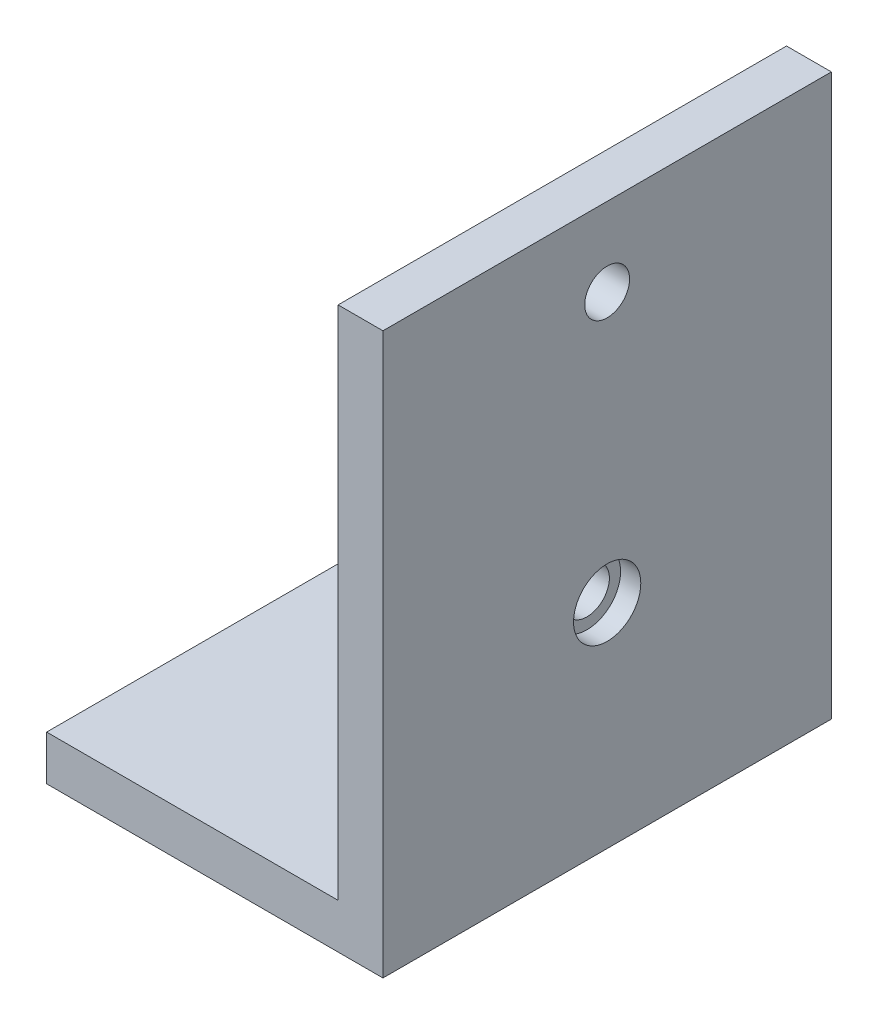
ISO-10303-21;
HEADER;
FILE_DESCRIPTION(('STEP AP214'),'2;1');
FILE_NAME('part.step','',(''),(''),'','','');
FILE_SCHEMA(('AUTOMOTIVE_DESIGN { 1 0 10303 214 1 1 1 1 }'));
ENDSEC;
DATA;
#1=APPLICATION_CONTEXT('core data for automotive mechanical design processes');
#2=APPLICATION_PROTOCOL_DEFINITION('international standard','automotive_design',2000,#1);
#3=PRODUCT_CONTEXT('',#1,'mechanical');
#4=PRODUCT('Part','Part','',(#3));
#5=PRODUCT_RELATED_PRODUCT_CATEGORY('part','',(#4));
#6=PRODUCT_DEFINITION_FORMATION('','',#4);
#7=PRODUCT_DEFINITION_CONTEXT('part definition',#1,'design');
#8=PRODUCT_DEFINITION('design','',#6,#7);
#9=PRODUCT_DEFINITION_SHAPE('','',#8);
#10=(LENGTH_UNIT() NAMED_UNIT(*) SI_UNIT(.MILLI.,.METRE.));
#11=(NAMED_UNIT(*) PLANE_ANGLE_UNIT() SI_UNIT($,.RADIAN.));
#12=(NAMED_UNIT(*) SI_UNIT($,.STERADIAN.) SOLID_ANGLE_UNIT());
#13=UNCERTAINTY_MEASURE_WITH_UNIT(LENGTH_MEASURE(1.E-05),#10,'distance_accuracy_value','');
#14=(GEOMETRIC_REPRESENTATION_CONTEXT(3) GLOBAL_UNCERTAINTY_ASSIGNED_CONTEXT((#13)) GLOBAL_UNIT_ASSIGNED_CONTEXT((#10,
#11,#12)) REPRESENTATION_CONTEXT('',''));
#15=CARTESIAN_POINT('',(0.,0.,0.));
#16=DIRECTION('',(0.,0.,1.));
#17=DIRECTION('',(1.,0.,0.));
#18=AXIS2_PLACEMENT_3D('',#15,#16,#17);
#19=CARTESIAN_POINT('',(-10.,47.5,50.));
#20=DIRECTION('',(1.,0.,0.));
#21=DIRECTION('',(0.,0.,-1.));
#22=AXIS2_PLACEMENT_3D('',#19,#20,#21);
#23=CYLINDRICAL_SURFACE('',#22,5.);
#24=CARTESIAN_POINT('',(-10.,47.5,50.));
#25=DIRECTION('',(1.,0.,0.));
#26=DIRECTION('',(0.,0.,-1.));
#27=AXIS2_PLACEMENT_3D('',#24,#25,#26);
#28=CIRCLE('',#27,5.);
#29=CARTESIAN_POINT('',(-10.,47.5,45.));
#30=VERTEX_POINT('',#29);
#31=EDGE_CURVE('E216',#30,#30,#28,.T.);
#32=ORIENTED_EDGE('',*,*,#31,.F.);
#33=EDGE_LOOP('',(#32));
#34=FACE_BOUND('',#33,.T.);
#35=CARTESIAN_POINT('',(-4.5,47.5,50.));
#36=DIRECTION('',(1.,0.,0.));
#37=DIRECTION('',(0.,0.,-1.));
#38=AXIS2_PLACEMENT_3D('',#35,#36,#37);
#39=CIRCLE('',#38,5.);
#40=CARTESIAN_POINT('',(-4.5,47.5,45.));
#41=VERTEX_POINT('',#40);
#42=EDGE_CURVE('E37',#41,#41,#39,.F.);
#43=ORIENTED_EDGE('',*,*,#42,.F.);
#44=EDGE_LOOP('',(#43));
#45=FACE_BOUND('',#44,.T.);
#46=ADVANCED_FACE('F33',(#34,#45),#23,.F.);
#47=CARTESIAN_POINT('',(0.,10.,100.));
#48=DIRECTION('',(0.,-1.,0.));
#49=DIRECTION('',(0.,0.,-1.));
#50=AXIS2_PLACEMENT_3D('',#47,#48,#49);
#51=PLANE('',#50);
#52=DIRECTION('',(1.,0.,0.));
#53=VECTOR('',#52,1.);
#54=CARTESIAN_POINT('',(0.,10.,0.));
#55=LINE('',#54,#53);
#56=CARTESIAN_POINT('',(-10.,10.,0.));
#57=VERTEX_POINT('',#56);
#58=CARTESIAN_POINT('',(-75.,10.,0.));
#59=VERTEX_POINT('',#58);
#60=EDGE_CURVE('E116',#57,#59,#55,.F.);
#61=ORIENTED_EDGE('',*,*,#60,.T.);
#62=DIRECTION('',(0.,0.,-1.));
#63=VECTOR('',#62,1.);
#64=CARTESIAN_POINT('',(-75.,10.,100.));
#65=LINE('',#64,#63);
#66=CARTESIAN_POINT('',(-75.,10.,100.));
#67=VERTEX_POINT('',#66);
#68=EDGE_CURVE('E11',#67,#59,#65,.T.);
#69=ORIENTED_EDGE('',*,*,#68,.F.);
#70=DIRECTION('',(1.,0.,0.));
#71=VECTOR('',#70,1.);
#72=CARTESIAN_POINT('',(0.,10.,100.));
#73=LINE('',#72,#71);
#74=CARTESIAN_POINT('',(-10.,10.,100.));
#75=VERTEX_POINT('',#74);
#76=EDGE_CURVE('E81',#75,#67,#73,.F.);
#77=ORIENTED_EDGE('',*,*,#76,.F.);
#78=DIRECTION('',(0.,0.,-1.));
#79=VECTOR('',#78,1.);
#80=CARTESIAN_POINT('',(-10.,10.,100.));
#81=LINE('',#80,#79);
#82=EDGE_CURVE('E112',#75,#57,#81,.T.);
#83=ORIENTED_EDGE('',*,*,#82,.T.);
#84=EDGE_LOOP('',(#61,#69,#77,#83));
#85=FACE_BOUND('',#84,.T.);
#86=ADVANCED_FACE('F35',(#85),#51,.F.);
#87=CARTESIAN_POINT('',(-75.,0.,100.));
#88=DIRECTION('',(-1.,0.,0.));
#89=DIRECTION('',(0.,0.,1.));
#90=AXIS2_PLACEMENT_3D('',#87,#88,#89);
#91=PLANE('',#90);
#92=DIRECTION('',(0.,1.,0.));
#93=VECTOR('',#92,1.);
#94=CARTESIAN_POINT('',(-75.,0.,0.));
#95=LINE('',#94,#93);
#96=CARTESIAN_POINT('',(-75.,0.,0.));
#97=VERTEX_POINT('',#96);
#98=EDGE_CURVE('E119',#97,#59,#95,.T.);
#99=ORIENTED_EDGE('',*,*,#98,.F.);
#100=DIRECTION('',(0.,0.,-1.));
#101=VECTOR('',#100,1.);
#102=CARTESIAN_POINT('',(-75.,0.,100.));
#103=LINE('',#102,#101);
#104=CARTESIAN_POINT('',(-75.,0.,100.));
#105=VERTEX_POINT('',#104);
#106=EDGE_CURVE('E43',#105,#97,#103,.T.);
#107=ORIENTED_EDGE('',*,*,#106,.F.);
#108=DIRECTION('',(0.,1.,0.));
#109=VECTOR('',#108,1.);
#110=CARTESIAN_POINT('',(-75.,0.,100.));
#111=LINE('',#110,#109);
#112=EDGE_CURVE('E224',#105,#67,#111,.T.);
#113=ORIENTED_EDGE('',*,*,#112,.T.);
#114=ORIENTED_EDGE('',*,*,#68,.T.);
#115=EDGE_LOOP('',(#99,#107,#113,#114));
#116=FACE_BOUND('',#115,.T.);
#117=ADVANCED_FACE('F139',(#116),#91,.T.);
#118=CARTESIAN_POINT('',(0.,0.,100.));
#119=DIRECTION('',(0.,-1.,0.));
#120=DIRECTION('',(0.,0.,-1.));
#121=AXIS2_PLACEMENT_3D('',#118,#119,#120);
#122=PLANE('',#121);
#123=DIRECTION('',(-1.,0.,0.));
#124=VECTOR('',#123,1.);
#125=CARTESIAN_POINT('',(0.,0.,0.));
#126=LINE('',#125,#124);
#127=CARTESIAN_POINT('',(0.,0.,0.));
#128=VERTEX_POINT('',#127);
#129=EDGE_CURVE('E123',#128,#97,#126,.T.);
#130=ORIENTED_EDGE('',*,*,#129,.F.);
#131=DIRECTION('',(0.,0.,-1.));
#132=VECTOR('',#131,1.);
#133=CARTESIAN_POINT('',(0.,0.,100.));
#134=LINE('',#133,#132);
#135=CARTESIAN_POINT('',(0.,0.,100.));
#136=VERTEX_POINT('',#135);
#137=EDGE_CURVE('E102',#136,#128,#134,.T.);
#138=ORIENTED_EDGE('',*,*,#137,.F.);
#139=DIRECTION('',(-1.,0.,0.));
#140=VECTOR('',#139,1.);
#141=CARTESIAN_POINT('',(0.,0.,100.));
#142=LINE('',#141,#140);
#143=EDGE_CURVE('E108',#136,#105,#142,.T.);
#144=ORIENTED_EDGE('',*,*,#143,.T.);
#145=ORIENTED_EDGE('',*,*,#106,.T.);
#146=EDGE_LOOP('',(#130,#138,#144,#145));
#147=FACE_BOUND('',#146,.T.);
#148=ADVANCED_FACE('F136',(#147),#122,.T.);
#149=CARTESIAN_POINT('',(0.,125.,100.));
#150=DIRECTION('',(1.,0.,0.));
#151=DIRECTION('',(0.,0.,-1.));
#152=AXIS2_PLACEMENT_3D('',#149,#150,#151);
#153=PLANE('',#152);
#154=CARTESIAN_POINT('',(0.,47.5,50.));
#155=DIRECTION('',(1.,0.,0.));
#156=DIRECTION('',(0.,0.,-1.));
#157=AXIS2_PLACEMENT_3D('',#154,#155,#156);
#158=CIRCLE('',#157,7.5);
#159=CARTESIAN_POINT('',(0.,47.5,42.5));
#160=VERTEX_POINT('',#159);
#161=EDGE_CURVE('E211',#160,#160,#158,.T.);
#162=ORIENTED_EDGE('',*,*,#161,.F.);
#163=EDGE_LOOP('',(#162));
#164=FACE_BOUND('',#163,.T.);
#165=CARTESIAN_POINT('',(0.,107.5,50.));
#166=DIRECTION('',(1.,0.,0.));
#167=DIRECTION('',(0.,0.,-1.));
#168=AXIS2_PLACEMENT_3D('',#165,#166,#167);
#169=CIRCLE('',#168,5.);
#170=CARTESIAN_POINT('',(0.,107.5,45.));
#171=VERTEX_POINT('',#170);
#172=EDGE_CURVE('E218',#171,#171,#169,.T.);
#173=ORIENTED_EDGE('',*,*,#172,.F.);
#174=EDGE_LOOP('',(#173));
#175=FACE_BOUND('',#174,.T.);
#176=DIRECTION('',(0.,-1.,0.));
#177=VECTOR('',#176,1.);
#178=CARTESIAN_POINT('',(0.,125.,0.));
#179=LINE('',#178,#177);
#180=CARTESIAN_POINT('',(0.,125.,0.));
#181=VERTEX_POINT('',#180);
#182=EDGE_CURVE('E97',#181,#128,#179,.T.);
#183=ORIENTED_EDGE('',*,*,#182,.F.);
#184=DIRECTION('',(0.,0.,-1.));
#185=VECTOR('',#184,1.);
#186=CARTESIAN_POINT('',(0.,125.,100.));
#187=LINE('',#186,#185);
#188=CARTESIAN_POINT('',(0.,125.,100.));
#189=VERTEX_POINT('',#188);
#190=EDGE_CURVE('E92',#189,#181,#187,.T.);
#191=ORIENTED_EDGE('',*,*,#190,.F.);
#192=DIRECTION('',(0.,-1.,0.));
#193=VECTOR('',#192,1.);
#194=CARTESIAN_POINT('',(0.,125.,100.));
#195=LINE('',#194,#193);
#196=EDGE_CURVE('E95',#189,#136,#195,.T.);
#197=ORIENTED_EDGE('',*,*,#196,.T.);
#198=ORIENTED_EDGE('',*,*,#137,.T.);
#199=EDGE_LOOP('',(#183,#191,#197,#198));
#200=FACE_BOUND('',#199,.T.);
#201=ADVANCED_FACE('F94',(#164,#175,#200),#153,.T.);
#202=CARTESIAN_POINT('',(-10.,125.,100.));
#203=DIRECTION('',(0.,1.,0.));
#204=DIRECTION('',(0.,0.,1.));
#205=AXIS2_PLACEMENT_3D('',#202,#203,#204);
#206=PLANE('',#205);
#207=DIRECTION('',(1.,0.,0.));
#208=VECTOR('',#207,1.);
#209=CARTESIAN_POINT('',(-10.,125.,0.));
#210=LINE('',#209,#208);
#211=CARTESIAN_POINT('',(-10.,125.,0.));
#212=VERTEX_POINT('',#211);
#213=EDGE_CURVE('E127',#212,#181,#210,.T.);
#214=ORIENTED_EDGE('',*,*,#213,.F.);
#215=DIRECTION('',(0.,0.,-1.));
#216=VECTOR('',#215,1.);
#217=CARTESIAN_POINT('',(-10.,125.,100.));
#218=LINE('',#217,#216);
#219=CARTESIAN_POINT('',(-10.,125.,100.));
#220=VERTEX_POINT('',#219);
#221=EDGE_CURVE('E72',#220,#212,#218,.T.);
#222=ORIENTED_EDGE('',*,*,#221,.F.);
#223=DIRECTION('',(1.,0.,0.));
#224=VECTOR('',#223,1.);
#225=CARTESIAN_POINT('',(-10.,125.,100.));
#226=LINE('',#225,#224);
#227=EDGE_CURVE('E106',#220,#189,#226,.T.);
#228=ORIENTED_EDGE('',*,*,#227,.T.);
#229=ORIENTED_EDGE('',*,*,#190,.T.);
#230=EDGE_LOOP('',(#214,#222,#228,#229));
#231=FACE_BOUND('',#230,.T.);
#232=ADVANCED_FACE('F110',(#231),#206,.T.);
#233=CARTESIAN_POINT('',(-10.,125.,100.));
#234=DIRECTION('',(1.,0.,0.));
#235=DIRECTION('',(0.,0.,-1.));
#236=AXIS2_PLACEMENT_3D('',#233,#234,#235);
#237=PLANE('',#236);
#238=ORIENTED_EDGE('',*,*,#31,.T.);
#239=EDGE_LOOP('',(#238));
#240=FACE_BOUND('',#239,.T.);
#241=CARTESIAN_POINT('',(-10.,107.5,50.));
#242=DIRECTION('',(1.,0.,0.));
#243=DIRECTION('',(0.,0.,-1.));
#244=AXIS2_PLACEMENT_3D('',#241,#242,#243);
#245=CIRCLE('',#244,5.);
#246=CARTESIAN_POINT('',(-10.,107.5,45.));
#247=VERTEX_POINT('',#246);
#248=EDGE_CURVE('E120',#247,#247,#245,.T.);
#249=ORIENTED_EDGE('',*,*,#248,.T.);
#250=EDGE_LOOP('',(#249));
#251=FACE_BOUND('',#250,.T.);
#252=DIRECTION('',(0.,1.,0.));
#253=VECTOR('',#252,1.);
#254=CARTESIAN_POINT('',(-10.,125.,0.));
#255=LINE('',#254,#253);
#256=EDGE_CURVE('E75',#212,#57,#255,.F.);
#257=ORIENTED_EDGE('',*,*,#256,.T.);
#258=ORIENTED_EDGE('',*,*,#82,.F.);
#259=DIRECTION('',(0.,1.,0.));
#260=VECTOR('',#259,1.);
#261=CARTESIAN_POINT('',(-10.,125.,100.));
#262=LINE('',#261,#260);
#263=EDGE_CURVE('E51',#220,#75,#262,.F.);
#264=ORIENTED_EDGE('',*,*,#263,.F.);
#265=ORIENTED_EDGE('',*,*,#221,.T.);
#266=EDGE_LOOP('',(#257,#258,#264,#265));
#267=FACE_BOUND('',#266,.T.);
#268=ADVANCED_FACE('F144',(#240,#251,#267),#237,.F.);
#269=CARTESIAN_POINT('',(0.,0.,100.));
#270=DIRECTION('',(0.,0.,1.));
#271=DIRECTION('',(1.,0.,0.));
#272=AXIS2_PLACEMENT_3D('',#269,#270,#271);
#273=PLANE('',#272);
#274=ORIENTED_EDGE('',*,*,#76,.T.);
#275=ORIENTED_EDGE('',*,*,#112,.F.);
#276=ORIENTED_EDGE('',*,*,#143,.F.);
#277=ORIENTED_EDGE('',*,*,#196,.F.);
#278=ORIENTED_EDGE('',*,*,#227,.F.);
#279=ORIENTED_EDGE('',*,*,#263,.T.);
#280=EDGE_LOOP('',(#274,#275,#276,#277,#278,#279));
#281=FACE_BOUND('',#280,.T.);
#282=ADVANCED_FACE('F105',(#281),#273,.T.);
#283=CARTESIAN_POINT('',(0.,0.,0.));
#284=DIRECTION('',(0.,0.,1.));
#285=DIRECTION('',(1.,0.,0.));
#286=AXIS2_PLACEMENT_3D('',#283,#284,#285);
#287=PLANE('',#286);
#288=ORIENTED_EDGE('',*,*,#60,.F.);
#289=ORIENTED_EDGE('',*,*,#256,.F.);
#290=ORIENTED_EDGE('',*,*,#213,.T.);
#291=ORIENTED_EDGE('',*,*,#182,.T.);
#292=ORIENTED_EDGE('',*,*,#129,.T.);
#293=ORIENTED_EDGE('',*,*,#98,.T.);
#294=EDGE_LOOP('',(#288,#289,#290,#291,#292,#293));
#295=FACE_BOUND('',#294,.T.);
#296=ADVANCED_FACE('F142',(#295),#287,.F.);
#297=CARTESIAN_POINT('',(-10.,107.5,50.));
#298=DIRECTION('',(1.,0.,0.));
#299=DIRECTION('',(0.,0.,-1.));
#300=AXIS2_PLACEMENT_3D('',#297,#298,#299);
#301=CYLINDRICAL_SURFACE('',#300,5.);
#302=ORIENTED_EDGE('',*,*,#248,.F.);
#303=EDGE_LOOP('',(#302));
#304=FACE_BOUND('',#303,.T.);
#305=ORIENTED_EDGE('',*,*,#172,.T.);
#306=EDGE_LOOP('',(#305));
#307=FACE_BOUND('',#306,.T.);
#308=ADVANCED_FACE('F172',(#304,#307),#301,.F.);
#309=CARTESIAN_POINT('',(-4.5,47.5,50.));
#310=DIRECTION('',(1.,0.,0.));
#311=DIRECTION('',(0.,0.,-1.));
#312=AXIS2_PLACEMENT_3D('',#309,#310,#311);
#313=PLANE('',#312);
#314=CARTESIAN_POINT('',(-4.5,47.5,50.));
#315=DIRECTION('',(1.,0.,0.));
#316=DIRECTION('',(0.,0.,-1.));
#317=AXIS2_PLACEMENT_3D('',#314,#315,#316);
#318=CIRCLE('',#317,7.5);
#319=CARTESIAN_POINT('',(-4.5,47.5,42.5));
#320=VERTEX_POINT('',#319);
#321=EDGE_CURVE('E208',#320,#320,#318,.T.);
#322=ORIENTED_EDGE('',*,*,#321,.T.);
#323=EDGE_LOOP('',(#322));
#324=FACE_BOUND('',#323,.T.);
#325=ORIENTED_EDGE('',*,*,#42,.T.);
#326=EDGE_LOOP('',(#325));
#327=FACE_BOUND('',#326,.T.);
#328=ADVANCED_FACE('F174',(#324,#327),#313,.T.);
#329=CARTESIAN_POINT('',(-4.5,47.5,50.));
#330=DIRECTION('',(1.,0.,0.));
#331=DIRECTION('',(0.,0.,-1.));
#332=AXIS2_PLACEMENT_3D('',#329,#330,#331);
#333=CYLINDRICAL_SURFACE('',#332,7.5);
#334=ORIENTED_EDGE('',*,*,#321,.F.);
#335=EDGE_LOOP('',(#334));
#336=FACE_BOUND('',#335,.T.);
#337=ORIENTED_EDGE('',*,*,#161,.T.);
#338=EDGE_LOOP('',(#337));
#339=FACE_BOUND('',#338,.T.);
#340=ADVANCED_FACE('F170',(#336,#339),#333,.F.);
#341=CLOSED_SHELL('',(#46,#86,#117,#148,#201,#232,#268,#282,#296,#308,#328,#340));
#342=MANIFOLD_SOLID_BREP('B2',#341);
#343=ADVANCED_BREP_SHAPE_REPRESENTATION('',(#18,#342),#14);
#344=SHAPE_DEFINITION_REPRESENTATION(#9,#343);
ENDSEC;
END-ISO-10303-21;
